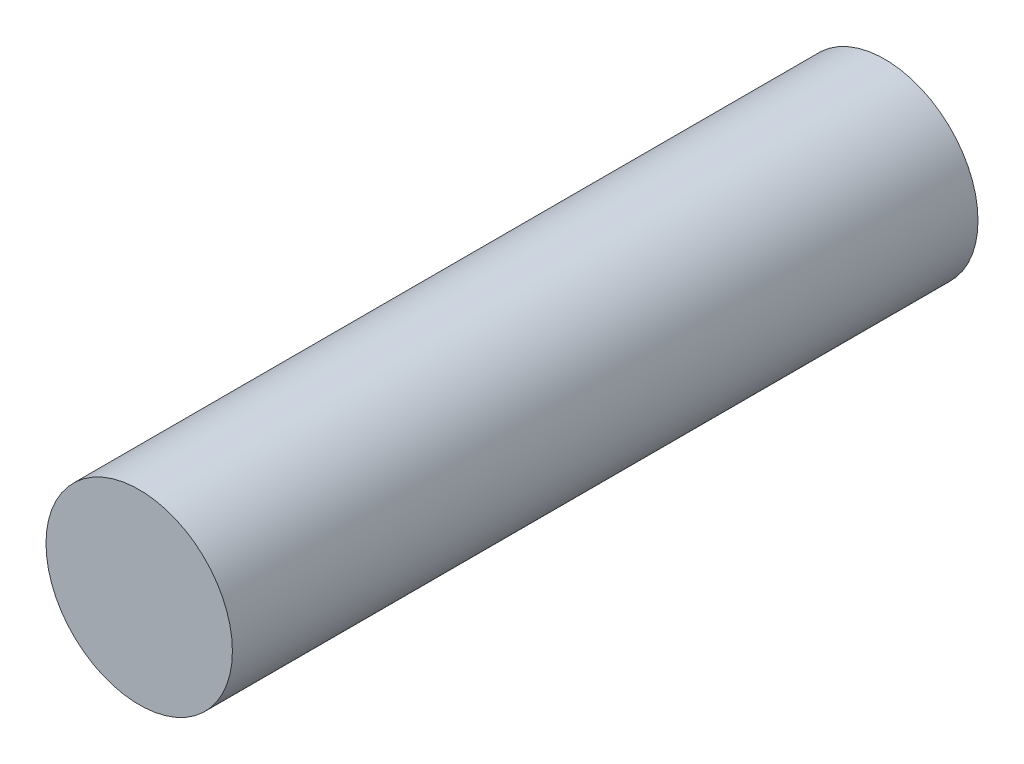
ISO-10303-21;
HEADER;
FILE_DESCRIPTION(('STEP AP214'),'2;1');
FILE_NAME('part.step','',(''),(''),'','','');
FILE_SCHEMA(('AUTOMOTIVE_DESIGN { 1 0 10303 214 1 1 1 1 }'));
ENDSEC;
DATA;
#1=APPLICATION_CONTEXT('core data for automotive mechanical design processes');
#2=APPLICATION_PROTOCOL_DEFINITION('international standard','automotive_design',2000,#1);
#3=PRODUCT_CONTEXT('',#1,'mechanical');
#4=PRODUCT('Part','Part','',(#3));
#5=PRODUCT_RELATED_PRODUCT_CATEGORY('part','',(#4));
#6=PRODUCT_DEFINITION_FORMATION('','',#4);
#7=PRODUCT_DEFINITION_CONTEXT('part definition',#1,'design');
#8=PRODUCT_DEFINITION('design','',#6,#7);
#9=PRODUCT_DEFINITION_SHAPE('','',#8);
#10=(LENGTH_UNIT() NAMED_UNIT(*) SI_UNIT(.MILLI.,.METRE.));
#11=(NAMED_UNIT(*) PLANE_ANGLE_UNIT() SI_UNIT($,.RADIAN.));
#12=(NAMED_UNIT(*) SI_UNIT($,.STERADIAN.) SOLID_ANGLE_UNIT());
#13=UNCERTAINTY_MEASURE_WITH_UNIT(LENGTH_MEASURE(1.E-05),#10,'distance_accuracy_value','');
#14=(GEOMETRIC_REPRESENTATION_CONTEXT(3) GLOBAL_UNCERTAINTY_ASSIGNED_CONTEXT((#13)) GLOBAL_UNIT_ASSIGNED_CONTEXT((#10,
#11,#12)) REPRESENTATION_CONTEXT('',''));
#15=CARTESIAN_POINT('',(0.,0.,0.));
#16=DIRECTION('',(0.,0.,1.));
#17=DIRECTION('',(1.,0.,0.));
#18=AXIS2_PLACEMENT_3D('',#15,#16,#17);
#19=CARTESIAN_POINT('',(0.,0.,76.2));
#20=DIRECTION('',(0.,0.,-1.));
#21=DIRECTION('',(-1.,0.,0.));
#22=AXIS2_PLACEMENT_3D('',#19,#20,#21);
#23=CYLINDRICAL_SURFACE('',#22,9.525);
#24=CARTESIAN_POINT('',(0.,0.,76.2));
#25=DIRECTION('',(0.,0.,1.));
#26=DIRECTION('',(1.,0.,0.));
#27=AXIS2_PLACEMENT_3D('',#24,#25,#26);
#28=CIRCLE('',#27,9.525);
#29=CARTESIAN_POINT('',(-9.525,0.,76.2));
#30=VERTEX_POINT('',#29);
#31=EDGE_CURVE('E10',#30,#30,#28,.T.);
#32=CARTESIAN_POINT('',(0.,0.,0.));
#33=DIRECTION('',(0.,0.,1.));
#34=DIRECTION('',(1.,0.,0.));
#35=AXIS2_PLACEMENT_3D('',#32,#33,#34);
#36=CIRCLE('',#35,9.525);
#37=CARTESIAN_POINT('',(-9.525,0.,0.));
#38=VERTEX_POINT('',#37);
#39=EDGE_CURVE('E33',#38,#38,#36,.T.);
#40=CARTESIAN_POINT('',(-9.525,0.,76.2));
#41=CARTESIAN_POINT('',(-9.525,0.,75.40625));
#42=CARTESIAN_POINT('',(-9.525,0.,74.6125));
#43=CARTESIAN_POINT('',(-9.525,0.,73.025));
#44=CARTESIAN_POINT('',(-9.525,0.,72.23125));
#45=CARTESIAN_POINT('',(-9.525,0.,70.64375));
#46=CARTESIAN_POINT('',(-9.525,0.,69.85));
#47=CARTESIAN_POINT('',(-9.525,0.,68.2625));
#48=CARTESIAN_POINT('',(-9.525,0.,67.46875));
#49=CARTESIAN_POINT('',(-9.525,0.,65.88125));
#50=CARTESIAN_POINT('',(-9.525,0.,65.0875));
#51=CARTESIAN_POINT('',(-9.525,0.,63.5));
#52=CARTESIAN_POINT('',(-9.525,0.,62.70625));
#53=CARTESIAN_POINT('',(-9.525,0.,61.11875));
#54=CARTESIAN_POINT('',(-9.525,0.,60.325));
#55=CARTESIAN_POINT('',(-9.525,0.,58.7375));
#56=CARTESIAN_POINT('',(-9.525,0.,57.94375));
#57=CARTESIAN_POINT('',(-9.525,0.,56.35625));
#58=CARTESIAN_POINT('',(-9.525,0.,55.5625));
#59=CARTESIAN_POINT('',(-9.525,0.,53.975));
#60=CARTESIAN_POINT('',(-9.525,0.,53.18125));
#61=CARTESIAN_POINT('',(-9.525,0.,51.59375));
#62=CARTESIAN_POINT('',(-9.525,0.,50.8));
#63=CARTESIAN_POINT('',(-9.525,0.,49.2125));
#64=CARTESIAN_POINT('',(-9.525,0.,48.41875));
#65=CARTESIAN_POINT('',(-9.525,0.,46.83125));
#66=CARTESIAN_POINT('',(-9.525,0.,46.0375));
#67=CARTESIAN_POINT('',(-9.525,0.,44.45));
#68=CARTESIAN_POINT('',(-9.525,0.,43.65625));
#69=CARTESIAN_POINT('',(-9.525,0.,42.06875));
#70=CARTESIAN_POINT('',(-9.525,0.,41.275));
#71=CARTESIAN_POINT('',(-9.525,0.,39.6875));
#72=CARTESIAN_POINT('',(-9.525,0.,38.89375));
#73=CARTESIAN_POINT('',(-9.525,0.,37.30625));
#74=CARTESIAN_POINT('',(-9.525,0.,36.5125));
#75=CARTESIAN_POINT('',(-9.525,0.,34.925));
#76=CARTESIAN_POINT('',(-9.525,0.,34.13125));
#77=CARTESIAN_POINT('',(-9.525,0.,32.54375));
#78=CARTESIAN_POINT('',(-9.525,0.,31.75));
#79=CARTESIAN_POINT('',(-9.525,0.,30.1625));
#80=CARTESIAN_POINT('',(-9.525,0.,29.36875));
#81=CARTESIAN_POINT('',(-9.525,0.,27.78125));
#82=CARTESIAN_POINT('',(-9.525,0.,26.9875));
#83=CARTESIAN_POINT('',(-9.525,0.,25.4));
#84=CARTESIAN_POINT('',(-9.525,0.,24.60625));
#85=CARTESIAN_POINT('',(-9.525,0.,23.01875));
#86=CARTESIAN_POINT('',(-9.525,0.,22.225));
#87=CARTESIAN_POINT('',(-9.525,0.,20.6375));
#88=CARTESIAN_POINT('',(-9.525,0.,19.84375));
#89=CARTESIAN_POINT('',(-9.525,0.,18.25625));
#90=CARTESIAN_POINT('',(-9.525,0.,17.4625));
#91=CARTESIAN_POINT('',(-9.525,0.,15.875));
#92=CARTESIAN_POINT('',(-9.525,0.,15.08125));
#93=CARTESIAN_POINT('',(-9.525,0.,13.49375));
#94=CARTESIAN_POINT('',(-9.525,0.,12.7));
#95=CARTESIAN_POINT('',(-9.525,0.,11.1125));
#96=CARTESIAN_POINT('',(-9.525,0.,10.31875));
#97=CARTESIAN_POINT('',(-9.525,0.,8.73125));
#98=CARTESIAN_POINT('',(-9.525,0.,7.93750000000001));
#99=CARTESIAN_POINT('',(-9.525,0.,6.35));
#100=CARTESIAN_POINT('',(-9.525,0.,5.55625));
#101=CARTESIAN_POINT('',(-9.525,0.,3.96875));
#102=CARTESIAN_POINT('',(-9.525,0.,3.175));
#103=CARTESIAN_POINT('',(-9.525,0.,1.5875));
#104=CARTESIAN_POINT('',(-9.525,0.,0.793750000000001));
#105=CARTESIAN_POINT('',(-9.525,0.,0.));
#106=B_SPLINE_CURVE_WITH_KNOTS('',3,(#40,#41,#42,#43,#44,#45,#46,#47,#48,#49,#50,#51,#52,#53,
#54,#55,#56,#57,#58,#59,#60,#61,#62,#63,#64,#65,#66,#67,#68,#69,#70,#71,#72,#73,#74,#75,#76,#77,
#78,#79,#80,#81,#82,#83,#84,#85,#86,#87,#88,#89,#90,#91,#92,#93,#94,#95,#96,#97,#98,#99,#100,
#101,#102,#103,#104,#105),.UNSPECIFIED.,.F.,.F.,(4,2,2,2,2,2,2,2,2,2,2,2,2,2,2,2,2,2,2,2,2,2,2,
2,2,2,2,2,2,2,2,2,4),(0.,2.38125,4.7625,7.14375,9.52500000000001,11.90625,14.2875,16.66875,
19.05,21.43125,23.8125,26.19375,28.575,30.95625,33.3375,35.71875,38.1,40.48125,42.8625,45.24375,
47.625,50.00625,52.3875,54.76875,57.15,59.53125,61.9125,64.29375,66.675,69.05625,71.4375,
73.81875,76.2),.UNSPECIFIED.);
#107=EDGE_CURVE('BSEAM30',#30,#38,#106,.T.);
#108=ORIENTED_EDGE('',*,*,#31,.F.);
#109=ORIENTED_EDGE('',*,*,#39,.T.);
#110=ORIENTED_EDGE('',*,*,#107,.T.);
#111=ORIENTED_EDGE('',*,*,#107,.F.);
#112=EDGE_LOOP('',(#108,#110,#109,#111));
#113=FACE_BOUND('',#112,.T.);
#114=ADVANCED_FACE('F30',(#113),#23,.T.);
#115=CARTESIAN_POINT('',(0.,0.,76.2));
#116=DIRECTION('',(0.,0.,1.));
#117=DIRECTION('',(1.,0.,0.));
#118=AXIS2_PLACEMENT_3D('',#115,#116,#117);
#119=PLANE('',#118);
#120=ORIENTED_EDGE('',*,*,#31,.T.);
#121=EDGE_LOOP('',(#120));
#122=FACE_BOUND('',#121,.T.);
#123=ADVANCED_FACE('F45',(#122),#119,.T.);
#124=CARTESIAN_POINT('',(0.,0.,0.));
#125=DIRECTION('',(0.,0.,1.));
#126=DIRECTION('',(1.,0.,0.));
#127=AXIS2_PLACEMENT_3D('',#124,#125,#126);
#128=PLANE('',#127);
#129=ORIENTED_EDGE('',*,*,#39,.F.);
#130=EDGE_LOOP('',(#129));
#131=FACE_BOUND('',#130,.T.);
#132=ADVANCED_FACE('F43',(#131),#128,.F.);
#133=CLOSED_SHELL('',(#114,#123,#132));
#134=MANIFOLD_SOLID_BREP('B2',#133);
#135=ADVANCED_BREP_SHAPE_REPRESENTATION('',(#18,#134),#14);
#136=SHAPE_DEFINITION_REPRESENTATION(#9,#135);
ENDSEC;
END-ISO-10303-21;
